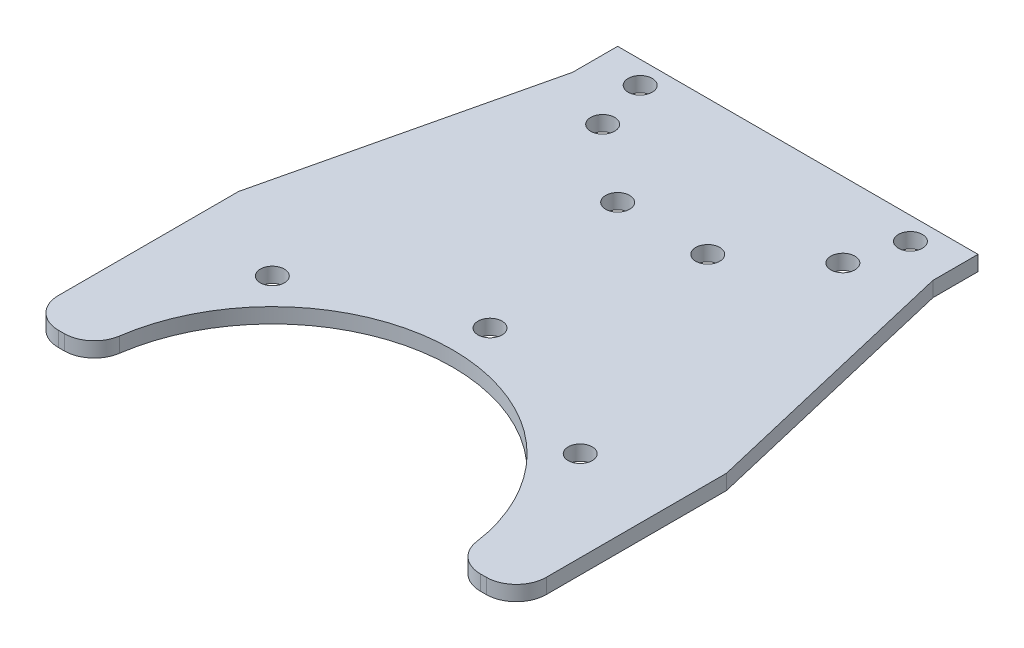
ISO-10303-21;
HEADER;
FILE_DESCRIPTION(('STEP AP214'),'2;1');
FILE_NAME('part.step','',(''),(''),'','','');
FILE_SCHEMA(('AUTOMOTIVE_DESIGN { 1 0 10303 214 1 1 1 1 }'));
ENDSEC;
DATA;
#1=APPLICATION_CONTEXT('core data for automotive mechanical design processes');
#2=APPLICATION_PROTOCOL_DEFINITION('international standard','automotive_design',2000,#1);
#3=PRODUCT_CONTEXT('',#1,'mechanical');
#4=PRODUCT('Part','Part','',(#3));
#5=PRODUCT_RELATED_PRODUCT_CATEGORY('part','',(#4));
#6=PRODUCT_DEFINITION_FORMATION('','',#4);
#7=PRODUCT_DEFINITION_CONTEXT('part definition',#1,'design');
#8=PRODUCT_DEFINITION('design','',#6,#7);
#9=PRODUCT_DEFINITION_SHAPE('','',#8);
#10=(LENGTH_UNIT() NAMED_UNIT(*) SI_UNIT(.MILLI.,.METRE.));
#11=(NAMED_UNIT(*) PLANE_ANGLE_UNIT() SI_UNIT($,.RADIAN.));
#12=(NAMED_UNIT(*) SI_UNIT($,.STERADIAN.) SOLID_ANGLE_UNIT());
#13=UNCERTAINTY_MEASURE_WITH_UNIT(LENGTH_MEASURE(1.E-05),#10,'distance_accuracy_value','');
#14=(GEOMETRIC_REPRESENTATION_CONTEXT(3) GLOBAL_UNCERTAINTY_ASSIGNED_CONTEXT((#13)) GLOBAL_UNIT_ASSIGNED_CONTEXT((#10,
#11,#12)) REPRESENTATION_CONTEXT('',''));
#15=CARTESIAN_POINT('',(0.,0.,0.));
#16=DIRECTION('',(0.,0.,1.));
#17=DIRECTION('',(1.,0.,0.));
#18=AXIS2_PLACEMENT_3D('',#15,#16,#17);
#19=CARTESIAN_POINT('',(-24.,1.,0.));
#20=DIRECTION('',(-1.,0.,0.));
#21=DIRECTION('',(0.,0.,1.));
#22=AXIS2_PLACEMENT_3D('',#19,#20,#21);
#23=PLANE('',#22);
#24=DIRECTION('',(0.,0.,-1.));
#25=VECTOR('',#24,1.);
#26=CARTESIAN_POINT('',(-24.,-1.,0.));
#27=LINE('',#26,#25);
#28=CARTESIAN_POINT('',(-24.,-1.,-32.));
#29=VERTEX_POINT('',#28);
#30=CARTESIAN_POINT('',(-24.,-1.,-38.));
#31=VERTEX_POINT('',#30);
#32=EDGE_CURVE('E153',#29,#31,#27,.T.);
#33=ORIENTED_EDGE('',*,*,#32,.F.);
#34=DIRECTION('',(0.,-1.,0.));
#35=VECTOR('',#34,1.);
#36=CARTESIAN_POINT('',(-24.,1.,-32.));
#37=LINE('',#36,#35);
#38=CARTESIAN_POINT('',(-24.,1.,-32.));
#39=VERTEX_POINT('',#38);
#40=EDGE_CURVE('E264',#39,#29,#37,.T.);
#41=ORIENTED_EDGE('',*,*,#40,.F.);
#42=DIRECTION('',(0.,0.,-1.));
#43=VECTOR('',#42,1.);
#44=CARTESIAN_POINT('',(-24.,1.,0.));
#45=LINE('',#44,#43);
#46=CARTESIAN_POINT('',(-24.,1.,-38.));
#47=VERTEX_POINT('',#46);
#48=EDGE_CURVE('E258',#39,#47,#45,.T.);
#49=ORIENTED_EDGE('',*,*,#48,.T.);
#50=DIRECTION('',(0.,-1.,0.));
#51=VECTOR('',#50,1.);
#52=CARTESIAN_POINT('',(-24.,1.,-38.));
#53=LINE('',#52,#51);
#54=EDGE_CURVE('E212',#47,#31,#53,.T.);
#55=ORIENTED_EDGE('',*,*,#54,.T.);
#56=EDGE_LOOP('',(#33,#41,#49,#55));
#57=FACE_BOUND('',#56,.T.);
#58=ADVANCED_FACE('F44',(#57),#23,.T.);
#59=CARTESIAN_POINT('',(-32.5,1.,0.));
#60=DIRECTION('',(-1.,0.,0.));
#61=DIRECTION('',(0.,0.,1.));
#62=AXIS2_PLACEMENT_3D('',#59,#60,#61);
#63=PLANE('',#62);
#64=DIRECTION('',(0.,1.,0.));
#65=VECTOR('',#64,1.);
#66=CARTESIAN_POINT('',(-32.5,-1.,3.99999999999996));
#67=LINE('',#66,#65);
#68=CARTESIAN_POINT('',(-32.5,-1.,3.99999999999996));
#69=VERTEX_POINT('',#68);
#70=CARTESIAN_POINT('',(-32.5,1.000006,3.99999999999996));
#71=VERTEX_POINT('',#70);
#72=EDGE_CURVE('E327',#69,#71,#67,.T.);
#73=ORIENTED_EDGE('',*,*,#72,.F.);
#74=DIRECTION('',(0.,0.,-1.));
#75=VECTOR('',#74,1.);
#76=CARTESIAN_POINT('',(-32.5,-1.,0.));
#77=LINE('',#76,#75);
#78=CARTESIAN_POINT('',(-32.5,-1.,28.));
#79=VERTEX_POINT('',#78);
#80=EDGE_CURVE('E215',#79,#69,#77,.T.);
#81=ORIENTED_EDGE('',*,*,#80,.F.);
#82=DIRECTION('',(0.,-1.,0.));
#83=VECTOR('',#82,1.);
#84=CARTESIAN_POINT('',(-32.5,1.,28.));
#85=LINE('',#84,#83);
#86=CARTESIAN_POINT('',(-32.5,1.,28.));
#87=VERTEX_POINT('',#86);
#88=EDGE_CURVE('E11',#79,#87,#85,.F.);
#89=ORIENTED_EDGE('',*,*,#88,.T.);
#90=DIRECTION('',(0.,0.,-1.));
#91=VECTOR('',#90,1.);
#92=CARTESIAN_POINT('',(-32.5,1.,0.));
#93=LINE('',#92,#91);
#94=EDGE_CURVE('E48',#87,#71,#93,.T.);
#95=ORIENTED_EDGE('',*,*,#94,.T.);
#96=EDGE_LOOP('',(#73,#81,#89,#95));
#97=FACE_BOUND('',#96,.T.);
#98=ADVANCED_FACE('F351',(#97),#63,.T.);
#99=CARTESIAN_POINT('',(0.,1.,32.));
#100=DIRECTION('',(0.,0.,-1.));
#101=DIRECTION('',(-1.,0.,0.));
#102=AXIS2_PLACEMENT_3D('',#99,#100,#101);
#103=PLANE('',#102);
#104=DIRECTION('',(1.,0.,0.));
#105=VECTOR('',#104,1.);
#106=CARTESIAN_POINT('',(0.,1.,32.));
#107=LINE('',#106,#105);
#108=CARTESIAN_POINT('',(-28.5,1.,32.));
#109=VERTEX_POINT('',#108);
#110=CARTESIAN_POINT('',(-27.712812921102,1.,32.));
#111=VERTEX_POINT('',#110);
#112=EDGE_CURVE('E178',#109,#111,#107,.T.);
#113=ORIENTED_EDGE('',*,*,#112,.F.);
#114=DIRECTION('',(0.,-1.,0.));
#115=VECTOR('',#114,1.);
#116=CARTESIAN_POINT('',(-28.5,-1.,32.));
#117=LINE('',#116,#115);
#118=CARTESIAN_POINT('',(-28.5,-1.,32.));
#119=VERTEX_POINT('',#118);
#120=EDGE_CURVE('E54',#109,#119,#117,.T.);
#121=ORIENTED_EDGE('',*,*,#120,.T.);
#122=DIRECTION('',(1.,0.,0.));
#123=VECTOR('',#122,1.);
#124=CARTESIAN_POINT('',(0.,-1.,32.));
#125=LINE('',#124,#123);
#126=CARTESIAN_POINT('',(-27.712812921102,-1.,32.));
#127=VERTEX_POINT('',#126);
#128=EDGE_CURVE('E218',#119,#127,#125,.T.);
#129=ORIENTED_EDGE('',*,*,#128,.T.);
#130=DIRECTION('',(0.,1.,0.));
#131=VECTOR('',#130,1.);
#132=CARTESIAN_POINT('',(-27.712812921102,1.,32.));
#133=LINE('',#132,#131);
#134=EDGE_CURVE('E292',#127,#111,#133,.T.);
#135=ORIENTED_EDGE('',*,*,#134,.T.);
#136=EDGE_LOOP('',(#113,#121,#129,#135));
#137=FACE_BOUND('',#136,.T.);
#138=ADVANCED_FACE('F298',(#137),#103,.F.);
#139=CARTESIAN_POINT('',(0.,1.,32.));
#140=DIRECTION('',(0.,-1.,0.));
#141=DIRECTION('',(0.,0.,-1.));
#142=AXIS2_PLACEMENT_3D('',#139,#140,#141);
#143=CYLINDRICAL_SURFACE('',#142,24.);
#144=CARTESIAN_POINT('',(0.,-1.,32.));
#145=DIRECTION('',(0.,1.,0.));
#146=DIRECTION('',(0.,0.,1.));
#147=AXIS2_PLACEMENT_3D('',#144,#145,#146);
#148=CIRCLE('',#147,24.);
#149=CARTESIAN_POINT('',(23.7538396466589,-1.,28.5714285714285));
#150=VERTEX_POINT('',#149);
#151=CARTESIAN_POINT('',(-23.7538396466589,-1.,28.5714285714285));
#152=VERTEX_POINT('',#151);
#153=EDGE_CURVE('E221',#150,#152,#148,.T.);
#154=ORIENTED_EDGE('',*,*,#153,.F.);
#155=DIRECTION('',(0.,-1.,0.));
#156=VECTOR('',#155,1.);
#157=CARTESIAN_POINT('',(23.7538396466589,1.,28.5714285714285));
#158=LINE('',#157,#156);
#159=CARTESIAN_POINT('',(23.7538396466589,1.,28.5714285714285));
#160=VERTEX_POINT('',#159);
#161=EDGE_CURVE('E290',#150,#160,#158,.F.);
#162=ORIENTED_EDGE('',*,*,#161,.T.);
#163=CARTESIAN_POINT('',(0.,1.,32.));
#164=DIRECTION('',(0.,1.,0.));
#165=DIRECTION('',(0.,0.,1.));
#166=AXIS2_PLACEMENT_3D('',#163,#164,#165);
#167=CIRCLE('',#166,24.);
#168=CARTESIAN_POINT('',(-23.7538396466589,1.,28.5714285714285));
#169=VERTEX_POINT('',#168);
#170=EDGE_CURVE('E176',#160,#169,#167,.T.);
#171=ORIENTED_EDGE('',*,*,#170,.T.);
#172=DIRECTION('',(0.,-1.,0.));
#173=VECTOR('',#172,1.);
#174=CARTESIAN_POINT('',(-23.7538396466589,1.,28.5714285714285));
#175=LINE('',#174,#173);
#176=EDGE_CURVE('E287',#169,#152,#175,.T.);
#177=ORIENTED_EDGE('',*,*,#176,.T.);
#178=EDGE_LOOP('',(#154,#162,#171,#177));
#179=FACE_BOUND('',#178,.T.);
#180=ADVANCED_FACE('F311',(#179),#143,.F.);
#181=CARTESIAN_POINT('',(27.712812921102,-1.,32.));
#182=VERTEX_POINT('',#181);
#183=CARTESIAN_POINT('',(28.5,-1.,32.));
#184=VERTEX_POINT('',#183);
#185=EDGE_CURVE('E222',#182,#184,#125,.T.);
#186=ORIENTED_EDGE('',*,*,#185,.T.);
#187=DIRECTION('',(0.,-1.,0.));
#188=VECTOR('',#187,1.);
#189=CARTESIAN_POINT('',(28.5,1.,32.));
#190=LINE('',#189,#188);
#191=CARTESIAN_POINT('',(28.5,1.,32.));
#192=VERTEX_POINT('',#191);
#193=EDGE_CURVE('E279',#184,#192,#190,.F.);
#194=ORIENTED_EDGE('',*,*,#193,.T.);
#195=CARTESIAN_POINT('',(27.712812921102,1.,32.));
#196=VERTEX_POINT('',#195);
#197=EDGE_CURVE('E173',#196,#192,#107,.T.);
#198=ORIENTED_EDGE('',*,*,#197,.F.);
#199=DIRECTION('',(0.,1.,0.));
#200=VECTOR('',#199,1.);
#201=CARTESIAN_POINT('',(27.712812921102,-1.,32.));
#202=LINE('',#201,#200);
#203=EDGE_CURVE('E276',#196,#182,#202,.F.);
#204=ORIENTED_EDGE('',*,*,#203,.T.);
#205=EDGE_LOOP('',(#186,#194,#198,#204));
#206=FACE_BOUND('',#205,.T.);
#207=ADVANCED_FACE('F381',(#206),#103,.F.);
#208=CARTESIAN_POINT('',(32.5,1.,0.));
#209=DIRECTION('',(-1.,0.,0.));
#210=DIRECTION('',(0.,0.,1.));
#211=AXIS2_PLACEMENT_3D('',#208,#209,#210);
#212=PLANE('',#211);
#213=DIRECTION('',(0.,0.,-1.));
#214=VECTOR('',#213,1.);
#215=CARTESIAN_POINT('',(32.5,-1.,0.));
#216=LINE('',#215,#214);
#217=CARTESIAN_POINT('',(32.5,-1.,28.));
#218=VERTEX_POINT('',#217);
#219=CARTESIAN_POINT('',(32.5,-1.,3.99999999999996));
#220=VERTEX_POINT('',#219);
#221=EDGE_CURVE('E164',#218,#220,#216,.T.);
#222=ORIENTED_EDGE('',*,*,#221,.T.);
#223=DIRECTION('',(0.,1.,0.));
#224=VECTOR('',#223,1.);
#225=CARTESIAN_POINT('',(32.5,-1.,3.99999999999996));
#226=LINE('',#225,#224);
#227=CARTESIAN_POINT('',(32.5,1.000006,3.99999999999996));
#228=VERTEX_POINT('',#227);
#229=EDGE_CURVE('E62',#220,#228,#226,.T.);
#230=ORIENTED_EDGE('',*,*,#229,.T.);
#231=DIRECTION('',(0.,0.,-1.));
#232=VECTOR('',#231,1.);
#233=CARTESIAN_POINT('',(32.5,1.,0.));
#234=LINE('',#233,#232);
#235=CARTESIAN_POINT('',(32.5,1.,28.));
#236=VERTEX_POINT('',#235);
#237=EDGE_CURVE('E161',#236,#228,#234,.T.);
#238=ORIENTED_EDGE('',*,*,#237,.F.);
#239=DIRECTION('',(0.,-1.,0.));
#240=VECTOR('',#239,1.);
#241=CARTESIAN_POINT('',(32.5,1.,28.));
#242=LINE('',#241,#240);
#243=EDGE_CURVE('E266',#236,#218,#242,.T.);
#244=ORIENTED_EDGE('',*,*,#243,.T.);
#245=EDGE_LOOP('',(#222,#230,#238,#244));
#246=FACE_BOUND('',#245,.T.);
#247=ADVANCED_FACE('F159',(#246),#212,.F.);
#248=CARTESIAN_POINT('',(24.,1.,0.));
#249=DIRECTION('',(-1.,0.,0.));
#250=DIRECTION('',(0.,0.,1.));
#251=AXIS2_PLACEMENT_3D('',#248,#249,#250);
#252=PLANE('',#251);
#253=DIRECTION('',(0.,0.,-1.));
#254=VECTOR('',#253,1.);
#255=CARTESIAN_POINT('',(24.,-1.,0.));
#256=LINE('',#255,#254);
#257=CARTESIAN_POINT('',(24.,-1.,-32.));
#258=VERTEX_POINT('',#257);
#259=CARTESIAN_POINT('',(24.,-1.,-38.));
#260=VERTEX_POINT('',#259);
#261=EDGE_CURVE('E226',#258,#260,#256,.T.);
#262=ORIENTED_EDGE('',*,*,#261,.T.);
#263=DIRECTION('',(0.,-1.,0.));
#264=VECTOR('',#263,1.);
#265=CARTESIAN_POINT('',(24.,1.,-38.));
#266=LINE('',#265,#264);
#267=CARTESIAN_POINT('',(24.,1.,-38.));
#268=VERTEX_POINT('',#267);
#269=EDGE_CURVE('E260',#268,#260,#266,.T.);
#270=ORIENTED_EDGE('',*,*,#269,.F.);
#271=DIRECTION('',(0.,0.,-1.));
#272=VECTOR('',#271,1.);
#273=CARTESIAN_POINT('',(24.,1.,0.));
#274=LINE('',#273,#272);
#275=CARTESIAN_POINT('',(24.,1.,-32.));
#276=VERTEX_POINT('',#275);
#277=EDGE_CURVE('E172',#276,#268,#274,.T.);
#278=ORIENTED_EDGE('',*,*,#277,.F.);
#279=DIRECTION('',(0.,-1.,0.));
#280=VECTOR('',#279,1.);
#281=CARTESIAN_POINT('',(24.,1.,-32.));
#282=LINE('',#281,#280);
#283=EDGE_CURVE('E150',#276,#258,#282,.T.);
#284=ORIENTED_EDGE('',*,*,#283,.T.);
#285=EDGE_LOOP('',(#262,#270,#278,#284));
#286=FACE_BOUND('',#285,.T.);
#287=ADVANCED_FACE('F335',(#286),#252,.F.);
#288=CARTESIAN_POINT('',(-6.,1.,-20.));
#289=DIRECTION('',(0.,-1.,0.));
#290=DIRECTION('',(0.,0.,-1.));
#291=AXIS2_PLACEMENT_3D('',#288,#289,#290);
#292=CYLINDRICAL_SURFACE('',#291,1.6);
#293=CARTESIAN_POINT('',(-6.,1.,-20.));
#294=DIRECTION('',(0.,1.,0.));
#295=DIRECTION('',(0.,0.,1.));
#296=AXIS2_PLACEMENT_3D('',#293,#294,#295);
#297=CIRCLE('',#296,1.6);
#298=CARTESIAN_POINT('',(-6.,1.,-18.4));
#299=VERTEX_POINT('',#298);
#300=EDGE_CURVE('E206',#299,#299,#297,.T.);
#301=ORIENTED_EDGE('',*,*,#300,.T.);
#302=EDGE_LOOP('',(#301));
#303=FACE_BOUND('',#302,.T.);
#304=CARTESIAN_POINT('',(-6.,-1.,-20.));
#305=DIRECTION('',(0.,1.,0.));
#306=DIRECTION('',(0.,0.,1.));
#307=AXIS2_PLACEMENT_3D('',#304,#305,#306);
#308=CIRCLE('',#307,1.6);
#309=CARTESIAN_POINT('',(-6.,-1.,-18.4));
#310=VERTEX_POINT('',#309);
#311=EDGE_CURVE('E252',#310,#310,#308,.T.);
#312=ORIENTED_EDGE('',*,*,#311,.F.);
#313=EDGE_LOOP('',(#312));
#314=FACE_BOUND('',#313,.T.);
#315=ADVANCED_FACE('F460',(#303,#314),#292,.F.);
#316=CARTESIAN_POINT('',(20.5060966544099,1.,11.4939033455901));
#317=DIRECTION('',(0.,-1.,0.));
#318=DIRECTION('',(0.,0.,-1.));
#319=AXIS2_PLACEMENT_3D('',#316,#317,#318);
#320=CYLINDRICAL_SURFACE('',#319,1.6);
#321=CARTESIAN_POINT('',(20.5060966544099,1.,11.4939033455901));
#322=DIRECTION('',(0.,1.,0.));
#323=DIRECTION('',(0.,0.,1.));
#324=AXIS2_PLACEMENT_3D('',#321,#322,#323);
#325=CIRCLE('',#324,1.6);
#326=CARTESIAN_POINT('',(20.5060966544099,1.,13.0939033455901));
#327=VERTEX_POINT('',#326);
#328=EDGE_CURVE('E203',#327,#327,#325,.T.);
#329=ORIENTED_EDGE('',*,*,#328,.T.);
#330=EDGE_LOOP('',(#329));
#331=FACE_BOUND('',#330,.T.);
#332=CARTESIAN_POINT('',(20.5060966544099,-1.,11.4939033455901));
#333=DIRECTION('',(0.,1.,0.));
#334=DIRECTION('',(0.,0.,1.));
#335=AXIS2_PLACEMENT_3D('',#332,#333,#334);
#336=CIRCLE('',#335,1.6);
#337=CARTESIAN_POINT('',(20.5060966544099,-1.,13.0939033455901));
#338=VERTEX_POINT('',#337);
#339=EDGE_CURVE('E249',#338,#338,#336,.T.);
#340=ORIENTED_EDGE('',*,*,#339,.F.);
#341=EDGE_LOOP('',(#340));
#342=FACE_BOUND('',#341,.T.);
#343=ADVANCED_FACE('F585',(#331,#342),#320,.F.);
#344=CARTESIAN_POINT('',(0.,1.,2.99999999999997));
#345=DIRECTION('',(0.,-1.,0.));
#346=DIRECTION('',(0.,0.,-1.));
#347=AXIS2_PLACEMENT_3D('',#344,#345,#346);
#348=CYLINDRICAL_SURFACE('',#347,1.6);
#349=CARTESIAN_POINT('',(0.,1.,2.99999999999997));
#350=DIRECTION('',(0.,1.,0.));
#351=DIRECTION('',(0.,0.,1.));
#352=AXIS2_PLACEMENT_3D('',#349,#350,#351);
#353=CIRCLE('',#352,1.6);
#354=CARTESIAN_POINT('',(0.,1.,4.59999999999997));
#355=VERTEX_POINT('',#354);
#356=EDGE_CURVE('E200',#355,#355,#353,.T.);
#357=ORIENTED_EDGE('',*,*,#356,.T.);
#358=EDGE_LOOP('',(#357));
#359=FACE_BOUND('',#358,.T.);
#360=CARTESIAN_POINT('',(0.,-1.,2.99999999999997));
#361=DIRECTION('',(0.,1.,0.));
#362=DIRECTION('',(0.,0.,1.));
#363=AXIS2_PLACEMENT_3D('',#360,#361,#362);
#364=CIRCLE('',#363,1.6);
#365=CARTESIAN_POINT('',(0.,-1.,4.59999999999997));
#366=VERTEX_POINT('',#365);
#367=EDGE_CURVE('E246',#366,#366,#364,.T.);
#368=ORIENTED_EDGE('',*,*,#367,.F.);
#369=EDGE_LOOP('',(#368));
#370=FACE_BOUND('',#369,.T.);
#371=ADVANCED_FACE('F575',(#359,#370),#348,.F.);
#372=CARTESIAN_POINT('',(-20.5060966544099,1.,11.4939033455901));
#373=DIRECTION('',(0.,-1.,0.));
#374=DIRECTION('',(0.,0.,-1.));
#375=AXIS2_PLACEMENT_3D('',#372,#373,#374);
#376=CYLINDRICAL_SURFACE('',#375,1.6);
#377=CARTESIAN_POINT('',(-20.5060966544099,1.,11.4939033455901));
#378=DIRECTION('',(0.,1.,0.));
#379=DIRECTION('',(0.,0.,1.));
#380=AXIS2_PLACEMENT_3D('',#377,#378,#379);
#381=CIRCLE('',#380,1.6);
#382=CARTESIAN_POINT('',(-20.5060966544099,1.,13.0939033455901));
#383=VERTEX_POINT('',#382);
#384=EDGE_CURVE('E197',#383,#383,#381,.T.);
#385=ORIENTED_EDGE('',*,*,#384,.T.);
#386=EDGE_LOOP('',(#385));
#387=FACE_BOUND('',#386,.T.);
#388=CARTESIAN_POINT('',(-20.5060966544099,-1.,11.4939033455901));
#389=DIRECTION('',(0.,1.,0.));
#390=DIRECTION('',(0.,0.,1.));
#391=AXIS2_PLACEMENT_3D('',#388,#389,#390);
#392=CIRCLE('',#391,1.6);
#393=CARTESIAN_POINT('',(-20.5060966544099,-1.,13.0939033455901));
#394=VERTEX_POINT('',#393);
#395=EDGE_CURVE('E243',#394,#394,#392,.T.);
#396=ORIENTED_EDGE('',*,*,#395,.F.);
#397=EDGE_LOOP('',(#396));
#398=FACE_BOUND('',#397,.T.);
#399=ADVANCED_FACE('F565',(#387,#398),#376,.F.);
#400=CARTESIAN_POINT('',(-16.,1.,-28.));
#401=DIRECTION('',(0.,-1.,0.));
#402=DIRECTION('',(0.,0.,-1.));
#403=AXIS2_PLACEMENT_3D('',#400,#401,#402);
#404=CYLINDRICAL_SURFACE('',#403,1.6);
#405=CARTESIAN_POINT('',(-16.,1.,-28.));
#406=DIRECTION('',(0.,1.,0.));
#407=DIRECTION('',(0.,0.,1.));
#408=AXIS2_PLACEMENT_3D('',#405,#406,#407);
#409=CIRCLE('',#408,1.6);
#410=CARTESIAN_POINT('',(-16.,1.,-26.4));
#411=VERTEX_POINT('',#410);
#412=EDGE_CURVE('E194',#411,#411,#409,.T.);
#413=ORIENTED_EDGE('',*,*,#412,.T.);
#414=EDGE_LOOP('',(#413));
#415=FACE_BOUND('',#414,.T.);
#416=CARTESIAN_POINT('',(-16.,-1.,-28.));
#417=DIRECTION('',(0.,1.,0.));
#418=DIRECTION('',(0.,0.,1.));
#419=AXIS2_PLACEMENT_3D('',#416,#417,#418);
#420=CIRCLE('',#419,1.6);
#421=CARTESIAN_POINT('',(-16.,-1.,-26.4));
#422=VERTEX_POINT('',#421);
#423=EDGE_CURVE('E240',#422,#422,#420,.T.);
#424=ORIENTED_EDGE('',*,*,#423,.F.);
#425=EDGE_LOOP('',(#424));
#426=FACE_BOUND('',#425,.T.);
#427=ADVANCED_FACE('F555',(#415,#426),#404,.F.);
#428=CARTESIAN_POINT('',(16.,1.,-28.));
#429=DIRECTION('',(0.,-1.,0.));
#430=DIRECTION('',(0.,0.,-1.));
#431=AXIS2_PLACEMENT_3D('',#428,#429,#430);
#432=CYLINDRICAL_SURFACE('',#431,1.6);
#433=CARTESIAN_POINT('',(16.,1.,-28.));
#434=DIRECTION('',(0.,1.,0.));
#435=DIRECTION('',(0.,0.,1.));
#436=AXIS2_PLACEMENT_3D('',#433,#434,#435);
#437=CIRCLE('',#436,1.6);
#438=CARTESIAN_POINT('',(16.,1.,-26.4));
#439=VERTEX_POINT('',#438);
#440=EDGE_CURVE('E191',#439,#439,#437,.F.);
#441=ORIENTED_EDGE('',*,*,#440,.F.);
#442=EDGE_LOOP('',(#441));
#443=FACE_BOUND('',#442,.T.);
#444=CARTESIAN_POINT('',(16.,-1.,-28.));
#445=DIRECTION('',(0.,1.,0.));
#446=DIRECTION('',(0.,0.,1.));
#447=AXIS2_PLACEMENT_3D('',#444,#445,#446);
#448=CIRCLE('',#447,1.6);
#449=CARTESIAN_POINT('',(16.,-1.,-26.4));
#450=VERTEX_POINT('',#449);
#451=EDGE_CURVE('E237',#450,#450,#448,.F.);
#452=ORIENTED_EDGE('',*,*,#451,.T.);
#453=EDGE_LOOP('',(#452));
#454=FACE_BOUND('',#453,.T.);
#455=ADVANCED_FACE('F545',(#443,#454),#432,.F.);
#456=CARTESIAN_POINT('',(-18.,1.,-35.));
#457=DIRECTION('',(0.,-1.,0.));
#458=DIRECTION('',(0.,0.,-1.));
#459=AXIS2_PLACEMENT_3D('',#456,#457,#458);
#460=CYLINDRICAL_SURFACE('',#459,1.6);
#461=CARTESIAN_POINT('',(-18.,1.,-35.));
#462=DIRECTION('',(0.,1.,0.));
#463=DIRECTION('',(0.,0.,1.));
#464=AXIS2_PLACEMENT_3D('',#461,#462,#463);
#465=CIRCLE('',#464,1.6);
#466=CARTESIAN_POINT('',(-18.,1.,-33.4));
#467=VERTEX_POINT('',#466);
#468=EDGE_CURVE('E188',#467,#467,#465,.F.);
#469=ORIENTED_EDGE('',*,*,#468,.F.);
#470=EDGE_LOOP('',(#469));
#471=FACE_BOUND('',#470,.T.);
#472=CARTESIAN_POINT('',(-18.,-1.,-35.));
#473=DIRECTION('',(0.,1.,0.));
#474=DIRECTION('',(0.,0.,1.));
#475=AXIS2_PLACEMENT_3D('',#472,#473,#474);
#476=CIRCLE('',#475,1.6);
#477=CARTESIAN_POINT('',(-18.,-1.,-33.4));
#478=VERTEX_POINT('',#477);
#479=EDGE_CURVE('E234',#478,#478,#476,.F.);
#480=ORIENTED_EDGE('',*,*,#479,.T.);
#481=EDGE_LOOP('',(#480));
#482=FACE_BOUND('',#481,.T.);
#483=ADVANCED_FACE('F535',(#471,#482),#460,.F.);
#484=CARTESIAN_POINT('',(18.,1.,-35.));
#485=DIRECTION('',(0.,-1.,0.));
#486=DIRECTION('',(0.,0.,-1.));
#487=AXIS2_PLACEMENT_3D('',#484,#485,#486);
#488=CYLINDRICAL_SURFACE('',#487,1.6);
#489=CARTESIAN_POINT('',(18.,1.,-35.));
#490=DIRECTION('',(0.,1.,0.));
#491=DIRECTION('',(0.,0.,1.));
#492=AXIS2_PLACEMENT_3D('',#489,#490,#491);
#493=CIRCLE('',#492,1.6);
#494=CARTESIAN_POINT('',(18.,1.,-33.4));
#495=VERTEX_POINT('',#494);
#496=EDGE_CURVE('E185',#495,#495,#493,.T.);
#497=ORIENTED_EDGE('',*,*,#496,.T.);
#498=EDGE_LOOP('',(#497));
#499=FACE_BOUND('',#498,.T.);
#500=CARTESIAN_POINT('',(18.,-1.,-35.));
#501=DIRECTION('',(0.,1.,0.));
#502=DIRECTION('',(0.,0.,1.));
#503=AXIS2_PLACEMENT_3D('',#500,#501,#502);
#504=CIRCLE('',#503,1.6);
#505=CARTESIAN_POINT('',(18.,-1.,-33.4));
#506=VERTEX_POINT('',#505);
#507=EDGE_CURVE('E231',#506,#506,#504,.T.);
#508=ORIENTED_EDGE('',*,*,#507,.F.);
#509=EDGE_LOOP('',(#508));
#510=FACE_BOUND('',#509,.T.);
#511=ADVANCED_FACE('F526',(#499,#510),#488,.F.);
#512=CARTESIAN_POINT('',(0.,1.,-38.));
#513=DIRECTION('',(0.,0.,1.));
#514=DIRECTION('',(1.,0.,0.));
#515=AXIS2_PLACEMENT_3D('',#512,#513,#514);
#516=PLANE('',#515);
#517=DIRECTION('',(-1.,0.,0.));
#518=VECTOR('',#517,1.);
#519=CARTESIAN_POINT('',(0.,-1.,-38.));
#520=LINE('',#519,#518);
#521=EDGE_CURVE('E228',#260,#31,#520,.T.);
#522=ORIENTED_EDGE('',*,*,#521,.T.);
#523=ORIENTED_EDGE('',*,*,#54,.F.);
#524=DIRECTION('',(-1.,0.,0.));
#525=VECTOR('',#524,1.);
#526=CARTESIAN_POINT('',(0.,1.,-38.));
#527=LINE('',#526,#525);
#528=EDGE_CURVE('E174',#268,#47,#527,.T.);
#529=ORIENTED_EDGE('',*,*,#528,.F.);
#530=ORIENTED_EDGE('',*,*,#269,.T.);
#531=EDGE_LOOP('',(#522,#523,#529,#530));
#532=FACE_BOUND('',#531,.T.);
#533=ADVANCED_FACE('F342',(#532),#516,.F.);
#534=CARTESIAN_POINT('',(6.,1.,-20.));
#535=DIRECTION('',(0.,-1.,0.));
#536=DIRECTION('',(0.,0.,-1.));
#537=AXIS2_PLACEMENT_3D('',#534,#535,#536);
#538=CYLINDRICAL_SURFACE('',#537,1.6);
#539=CARTESIAN_POINT('',(6.,1.,-20.));
#540=DIRECTION('',(0.,1.,0.));
#541=DIRECTION('',(0.,0.,1.));
#542=AXIS2_PLACEMENT_3D('',#539,#540,#541);
#543=CIRCLE('',#542,1.6);
#544=CARTESIAN_POINT('',(6.,1.,-18.4));
#545=VERTEX_POINT('',#544);
#546=EDGE_CURVE('E209',#545,#545,#543,.F.);
#547=ORIENTED_EDGE('',*,*,#546,.F.);
#548=EDGE_LOOP('',(#547));
#549=FACE_BOUND('',#548,.T.);
#550=CARTESIAN_POINT('',(6.,-1.,-20.));
#551=DIRECTION('',(0.,1.,0.));
#552=DIRECTION('',(0.,0.,1.));
#553=AXIS2_PLACEMENT_3D('',#550,#551,#552);
#554=CIRCLE('',#553,1.6);
#555=CARTESIAN_POINT('',(6.,-1.,-18.4));
#556=VERTEX_POINT('',#555);
#557=EDGE_CURVE('E255',#556,#556,#554,.F.);
#558=ORIENTED_EDGE('',*,*,#557,.T.);
#559=EDGE_LOOP('',(#558));
#560=FACE_BOUND('',#559,.T.);
#561=ADVANCED_FACE('F472',(#549,#560),#538,.F.);
#562=CARTESIAN_POINT('',(0.,1.,0.));
#563=DIRECTION('',(0.,1.,0.));
#564=DIRECTION('',(0.,0.,1.));
#565=AXIS2_PLACEMENT_3D('',#562,#563,#564);
#566=PLANE('',#565);
#567=DIRECTION('',(0.229792683755957,0.,0.973239601789937));
#568=VECTOR('',#567,1.);
#569=CARTESIAN_POINT('',(29.8892746208661,1.,-7.05718984103782));
#570=LINE('',#569,#568);
#571=EDGE_CURVE('E147',#276,#228,#570,.T.);
#572=ORIENTED_EDGE('',*,*,#571,.F.);
#573=ORIENTED_EDGE('',*,*,#277,.T.);
#574=ORIENTED_EDGE('',*,*,#528,.T.);
#575=ORIENTED_EDGE('',*,*,#48,.F.);
#576=DIRECTION('',(0.229792683755957,0.,-0.973239601789937));
#577=VECTOR('',#576,1.);
#578=CARTESIAN_POINT('',(-29.8892746208661,1.,-7.05718984103782));
#579=LINE('',#578,#577);
#580=EDGE_CURVE('E154',#71,#39,#579,.T.);
#581=ORIENTED_EDGE('',*,*,#580,.F.);
#582=ORIENTED_EDGE('',*,*,#94,.F.);
#583=CARTESIAN_POINT('',(-28.5,1.,28.));
#584=DIRECTION('',(0.,1.,0.));
#585=DIRECTION('',(0.,0.,1.));
#586=AXIS2_PLACEMENT_3D('',#583,#584,#585);
#587=CIRCLE('',#586,4.);
#588=EDGE_CURVE('E282',#87,#109,#587,.T.);
#589=ORIENTED_EDGE('',*,*,#588,.T.);
#590=ORIENTED_EDGE('',*,*,#112,.T.);
#591=CARTESIAN_POINT('',(-27.712812921102,1.,28.));
#592=DIRECTION('',(0.,1.,0.));
#593=DIRECTION('',(0.,0.,1.));
#594=AXIS2_PLACEMENT_3D('',#591,#592,#593);
#595=CIRCLE('',#594,4.);
#596=EDGE_CURVE('E70',#111,#169,#595,.T.);
#597=ORIENTED_EDGE('',*,*,#596,.T.);
#598=ORIENTED_EDGE('',*,*,#170,.F.);
#599=CARTESIAN_POINT('',(27.712812921102,1.,28.));
#600=DIRECTION('',(0.,1.,0.));
#601=DIRECTION('',(0.,0.,1.));
#602=AXIS2_PLACEMENT_3D('',#599,#600,#601);
#603=CIRCLE('',#602,4.);
#604=EDGE_CURVE('E284',#160,#196,#603,.T.);
#605=ORIENTED_EDGE('',*,*,#604,.T.);
#606=ORIENTED_EDGE('',*,*,#197,.T.);
#607=CARTESIAN_POINT('',(28.5,1.,28.));
#608=DIRECTION('',(0.,1.,0.));
#609=DIRECTION('',(0.,0.,1.));
#610=AXIS2_PLACEMENT_3D('',#607,#608,#609);
#611=CIRCLE('',#610,4.);
#612=EDGE_CURVE('E171',#192,#236,#611,.T.);
#613=ORIENTED_EDGE('',*,*,#612,.T.);
#614=ORIENTED_EDGE('',*,*,#237,.T.);
#615=EDGE_LOOP('',(#572,#573,#574,#575,#581,#582,#589,#590,#597,#598,#605,#606,#613,#614));
#616=FACE_BOUND('',#615,.T.);
#617=ORIENTED_EDGE('',*,*,#496,.F.);
#618=EDGE_LOOP('',(#617));
#619=FACE_BOUND('',#618,.T.);
#620=ORIENTED_EDGE('',*,*,#468,.T.);
#621=EDGE_LOOP('',(#620));
#622=FACE_BOUND('',#621,.T.);
#623=ORIENTED_EDGE('',*,*,#440,.T.);
#624=EDGE_LOOP('',(#623));
#625=FACE_BOUND('',#624,.T.);
#626=ORIENTED_EDGE('',*,*,#412,.F.);
#627=EDGE_LOOP('',(#626));
#628=FACE_BOUND('',#627,.T.);
#629=ORIENTED_EDGE('',*,*,#384,.F.);
#630=EDGE_LOOP('',(#629));
#631=FACE_BOUND('',#630,.T.);
#632=ORIENTED_EDGE('',*,*,#356,.F.);
#633=EDGE_LOOP('',(#632));
#634=FACE_BOUND('',#633,.T.);
#635=ORIENTED_EDGE('',*,*,#328,.F.);
#636=EDGE_LOOP('',(#635));
#637=FACE_BOUND('',#636,.T.);
#638=ORIENTED_EDGE('',*,*,#300,.F.);
#639=EDGE_LOOP('',(#638));
#640=FACE_BOUND('',#639,.T.);
#641=ORIENTED_EDGE('',*,*,#546,.T.);
#642=EDGE_LOOP('',(#641));
#643=FACE_BOUND('',#642,.T.);
#644=ADVANCED_FACE('F167',(#616,#619,#622,#625,#628,#631,#634,#637,#640,#643),#566,.T.);
#645=CARTESIAN_POINT('',(0.,-1.,0.));
#646=DIRECTION('',(0.,1.,0.));
#647=DIRECTION('',(0.,0.,1.));
#648=AXIS2_PLACEMENT_3D('',#645,#646,#647);
#649=PLANE('',#648);
#650=ORIENTED_EDGE('',*,*,#261,.F.);
#651=DIRECTION('',(0.229792683755957,0.,0.973239601789937));
#652=VECTOR('',#651,1.);
#653=CARTESIAN_POINT('',(24.,-1.,-32.));
#654=LINE('',#653,#652);
#655=EDGE_CURVE('E165',#258,#220,#654,.T.);
#656=ORIENTED_EDGE('',*,*,#655,.T.);
#657=ORIENTED_EDGE('',*,*,#221,.F.);
#658=CARTESIAN_POINT('',(28.5,-1.,28.));
#659=DIRECTION('',(0.,1.,0.));
#660=DIRECTION('',(0.,0.,1.));
#661=AXIS2_PLACEMENT_3D('',#658,#659,#660);
#662=CIRCLE('',#661,4.);
#663=EDGE_CURVE('E274',#218,#184,#662,.F.);
#664=ORIENTED_EDGE('',*,*,#663,.T.);
#665=ORIENTED_EDGE('',*,*,#185,.F.);
#666=CARTESIAN_POINT('',(27.712812921102,-1.,28.));
#667=DIRECTION('',(0.,1.,0.));
#668=DIRECTION('',(0.,0.,1.));
#669=AXIS2_PLACEMENT_3D('',#666,#667,#668);
#670=CIRCLE('',#669,4.);
#671=EDGE_CURVE('E272',#182,#150,#670,.F.);
#672=ORIENTED_EDGE('',*,*,#671,.T.);
#673=ORIENTED_EDGE('',*,*,#153,.T.);
#674=CARTESIAN_POINT('',(-27.712812921102,-1.,28.));
#675=DIRECTION('',(0.,1.,0.));
#676=DIRECTION('',(0.,0.,1.));
#677=AXIS2_PLACEMENT_3D('',#674,#675,#676);
#678=CIRCLE('',#677,4.);
#679=EDGE_CURVE('E268',#152,#127,#678,.F.);
#680=ORIENTED_EDGE('',*,*,#679,.T.);
#681=ORIENTED_EDGE('',*,*,#128,.F.);
#682=CARTESIAN_POINT('',(-28.5,-1.,28.));
#683=DIRECTION('',(0.,1.,0.));
#684=DIRECTION('',(0.,0.,1.));
#685=AXIS2_PLACEMENT_3D('',#682,#683,#684);
#686=CIRCLE('',#685,4.);
#687=EDGE_CURVE('E270',#119,#79,#686,.F.);
#688=ORIENTED_EDGE('',*,*,#687,.T.);
#689=ORIENTED_EDGE('',*,*,#80,.T.);
#690=DIRECTION('',(0.229792683755957,0.,-0.973239601789937));
#691=VECTOR('',#690,1.);
#692=CARTESIAN_POINT('',(-24.,-1.,-32.));
#693=LINE('',#692,#691);
#694=EDGE_CURVE('E324',#69,#29,#693,.T.);
#695=ORIENTED_EDGE('',*,*,#694,.T.);
#696=ORIENTED_EDGE('',*,*,#32,.T.);
#697=ORIENTED_EDGE('',*,*,#521,.F.);
#698=EDGE_LOOP('',(#650,#656,#657,#664,#665,#672,#673,#680,#681,#688,#689,#695,#696,#697));
#699=FACE_BOUND('',#698,.T.);
#700=ORIENTED_EDGE('',*,*,#507,.T.);
#701=EDGE_LOOP('',(#700));
#702=FACE_BOUND('',#701,.T.);
#703=ORIENTED_EDGE('',*,*,#479,.F.);
#704=EDGE_LOOP('',(#703));
#705=FACE_BOUND('',#704,.T.);
#706=ORIENTED_EDGE('',*,*,#451,.F.);
#707=EDGE_LOOP('',(#706));
#708=FACE_BOUND('',#707,.T.);
#709=ORIENTED_EDGE('',*,*,#423,.T.);
#710=EDGE_LOOP('',(#709));
#711=FACE_BOUND('',#710,.T.);
#712=ORIENTED_EDGE('',*,*,#395,.T.);
#713=EDGE_LOOP('',(#712));
#714=FACE_BOUND('',#713,.T.);
#715=ORIENTED_EDGE('',*,*,#367,.T.);
#716=EDGE_LOOP('',(#715));
#717=FACE_BOUND('',#716,.T.);
#718=ORIENTED_EDGE('',*,*,#339,.T.);
#719=EDGE_LOOP('',(#718));
#720=FACE_BOUND('',#719,.T.);
#721=ORIENTED_EDGE('',*,*,#311,.T.);
#722=EDGE_LOOP('',(#721));
#723=FACE_BOUND('',#722,.T.);
#724=ORIENTED_EDGE('',*,*,#557,.F.);
#725=EDGE_LOOP('',(#724));
#726=FACE_BOUND('',#725,.T.);
#727=ADVANCED_FACE('F304',(#699,#702,#705,#708,#711,#714,#717,#720,#723,#726),#649,.F.);
#728=CARTESIAN_POINT('',(28.5,1.,28.));
#729=DIRECTION('',(0.,-1.,0.));
#730=DIRECTION('',(0.,0.,-1.));
#731=AXIS2_PLACEMENT_3D('',#728,#729,#730);
#732=CYLINDRICAL_SURFACE('',#731,4.);
#733=ORIENTED_EDGE('',*,*,#612,.F.);
#734=ORIENTED_EDGE('',*,*,#193,.F.);
#735=ORIENTED_EDGE('',*,*,#663,.F.);
#736=ORIENTED_EDGE('',*,*,#243,.F.);
#737=EDGE_LOOP('',(#733,#734,#735,#736));
#738=FACE_BOUND('',#737,.T.);
#739=ADVANCED_FACE('F360',(#738),#732,.T.);
#740=CARTESIAN_POINT('',(27.712812921102,1.,28.));
#741=DIRECTION('',(0.,-1.,0.));
#742=DIRECTION('',(0.,0.,-1.));
#743=AXIS2_PLACEMENT_3D('',#740,#741,#742);
#744=CYLINDRICAL_SURFACE('',#743,4.);
#745=ORIENTED_EDGE('',*,*,#604,.F.);
#746=ORIENTED_EDGE('',*,*,#161,.F.);
#747=ORIENTED_EDGE('',*,*,#671,.F.);
#748=ORIENTED_EDGE('',*,*,#203,.F.);
#749=EDGE_LOOP('',(#745,#746,#747,#748));
#750=FACE_BOUND('',#749,.T.);
#751=ADVANCED_FACE('F355',(#750),#744,.T.);
#752=CARTESIAN_POINT('',(-28.5,1.,28.));
#753=DIRECTION('',(0.,1.,0.));
#754=DIRECTION('',(0.,0.,1.));
#755=AXIS2_PLACEMENT_3D('',#752,#753,#754);
#756=CYLINDRICAL_SURFACE('',#755,4.);
#757=ORIENTED_EDGE('',*,*,#588,.F.);
#758=ORIENTED_EDGE('',*,*,#88,.F.);
#759=ORIENTED_EDGE('',*,*,#687,.F.);
#760=ORIENTED_EDGE('',*,*,#120,.F.);
#761=EDGE_LOOP('',(#757,#758,#759,#760));
#762=FACE_BOUND('',#761,.T.);
#763=ADVANCED_FACE('F353',(#762),#756,.T.);
#764=CARTESIAN_POINT('',(-27.712812921102,1.,28.));
#765=DIRECTION('',(0.,-1.,0.));
#766=DIRECTION('',(0.,0.,-1.));
#767=AXIS2_PLACEMENT_3D('',#764,#765,#766);
#768=CYLINDRICAL_SURFACE('',#767,4.);
#769=ORIENTED_EDGE('',*,*,#596,.F.);
#770=ORIENTED_EDGE('',*,*,#134,.F.);
#771=ORIENTED_EDGE('',*,*,#679,.F.);
#772=ORIENTED_EDGE('',*,*,#176,.F.);
#773=EDGE_LOOP('',(#769,#770,#771,#772));
#774=FACE_BOUND('',#773,.T.);
#775=ADVANCED_FACE('F46',(#774),#768,.T.);
#776=CARTESIAN_POINT('',(-24.,-1.,-32.));
#777=DIRECTION('',(0.973239601789937,0.,0.229792683755957));
#778=DIRECTION('',(0.229792683755957,0.,-0.973239601789937));
#779=AXIS2_PLACEMENT_3D('',#776,#777,#778);
#780=PLANE('',#779);
#781=ORIENTED_EDGE('',*,*,#580,.T.);
#782=ORIENTED_EDGE('',*,*,#40,.T.);
#783=ORIENTED_EDGE('',*,*,#694,.F.);
#784=ORIENTED_EDGE('',*,*,#72,.T.);
#785=EDGE_LOOP('',(#781,#782,#783,#784));
#786=FACE_BOUND('',#785,.T.);
#787=ADVANCED_FACE('F347',(#786),#780,.F.);
#788=CARTESIAN_POINT('',(24.,-1.,-32.));
#789=DIRECTION('',(-0.973239601789937,0.,0.229792683755957));
#790=DIRECTION('',(0.229792683755957,0.,0.973239601789937));
#791=AXIS2_PLACEMENT_3D('',#788,#789,#790);
#792=PLANE('',#791);
#793=ORIENTED_EDGE('',*,*,#571,.T.);
#794=ORIENTED_EDGE('',*,*,#229,.F.);
#795=ORIENTED_EDGE('',*,*,#655,.F.);
#796=ORIENTED_EDGE('',*,*,#283,.F.);
#797=EDGE_LOOP('',(#793,#794,#795,#796));
#798=FACE_BOUND('',#797,.T.);
#799=ADVANCED_FACE('F148',(#798),#792,.F.);
#800=CLOSED_SHELL('',(#58,#98,#138,#180,#207,#247,#287,#315,#343,#371,#399,#427,#455,#483,#511,
#533,#561,#644,#727,#739,#751,#763,#775,#787,#799));
#801=MANIFOLD_SOLID_BREP('B2',#800);
#802=ADVANCED_BREP_SHAPE_REPRESENTATION('',(#18,#801),#14);
#803=SHAPE_DEFINITION_REPRESENTATION(#9,#802);
ENDSEC;
END-ISO-10303-21;
